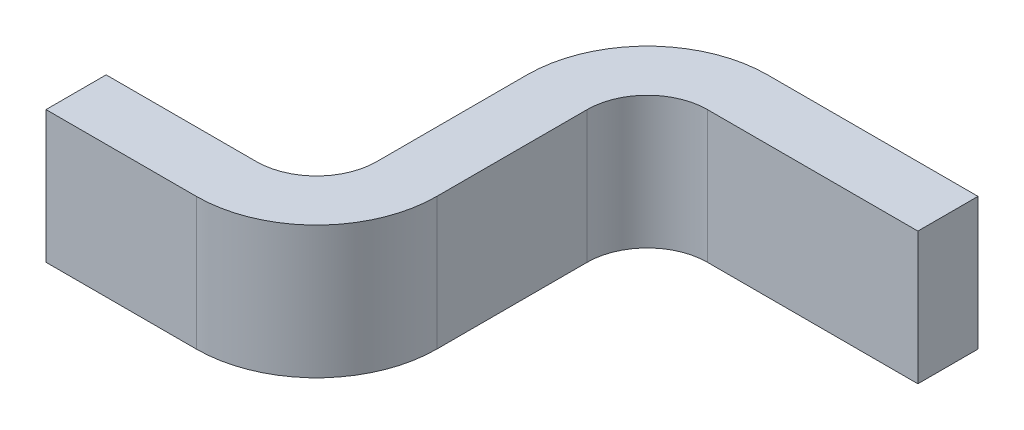
ISO-10303-21;
HEADER;
FILE_DESCRIPTION(('STEP AP214'),'2;1');
FILE_NAME('part.step','',(''),(''),'','','');
FILE_SCHEMA(('AUTOMOTIVE_DESIGN { 1 0 10303 214 1 1 1 1 }'));
ENDSEC;
DATA;
#1=APPLICATION_CONTEXT('core data for automotive mechanical design processes');
#2=APPLICATION_PROTOCOL_DEFINITION('international standard','automotive_design',2000,#1);
#3=PRODUCT_CONTEXT('',#1,'mechanical');
#4=PRODUCT('Part','Part','',(#3));
#5=PRODUCT_RELATED_PRODUCT_CATEGORY('part','',(#4));
#6=PRODUCT_DEFINITION_FORMATION('','',#4);
#7=PRODUCT_DEFINITION_CONTEXT('part definition',#1,'design');
#8=PRODUCT_DEFINITION('design','',#6,#7);
#9=PRODUCT_DEFINITION_SHAPE('','',#8);
#10=(LENGTH_UNIT() NAMED_UNIT(*) SI_UNIT(.MILLI.,.METRE.));
#11=(NAMED_UNIT(*) PLANE_ANGLE_UNIT() SI_UNIT($,.RADIAN.));
#12=(NAMED_UNIT(*) SI_UNIT($,.STERADIAN.) SOLID_ANGLE_UNIT());
#13=UNCERTAINTY_MEASURE_WITH_UNIT(LENGTH_MEASURE(1.E-05),#10,'distance_accuracy_value','');
#14=(GEOMETRIC_REPRESENTATION_CONTEXT(3) GLOBAL_UNCERTAINTY_ASSIGNED_CONTEXT((#13)) GLOBAL_UNIT_ASSIGNED_CONTEXT((#10,
#11,#12)) REPRESENTATION_CONTEXT('',''));
#15=CARTESIAN_POINT('',(0.,0.,0.));
#16=DIRECTION('',(0.,0.,1.));
#17=DIRECTION('',(1.,0.,0.));
#18=AXIS2_PLACEMENT_3D('',#15,#16,#17);
#19=CARTESIAN_POINT('',(0.,0.11,0.65));
#20=DIRECTION('',(0.,0.,-1.));
#21=DIRECTION('',(-1.,0.,0.));
#22=AXIS2_PLACEMENT_3D('',#19,#20,#21);
#23=PLANE('',#22);
#24=DIRECTION('',(1.,0.,0.));
#25=VECTOR('',#24,1.);
#26=CARTESIAN_POINT('',(0.,0.11,0.65));
#27=LINE('',#26,#25);
#28=CARTESIAN_POINT('',(0.25,0.11,0.65));
#29=VERTEX_POINT('',#28);
#30=CARTESIAN_POINT('',(0.,0.11,0.65));
#31=VERTEX_POINT('',#30);
#32=EDGE_CURVE('E104',#29,#31,#27,.F.);
#33=ORIENTED_EDGE('',*,*,#32,.T.);
#34=DIRECTION('',(0.,1.,0.));
#35=VECTOR('',#34,1.);
#36=CARTESIAN_POINT('',(0.,-0.11,0.65));
#37=LINE('',#36,#35);
#38=CARTESIAN_POINT('',(0.,-0.11,0.65));
#39=VERTEX_POINT('',#38);
#40=EDGE_CURVE('E113',#39,#31,#37,.T.);
#41=ORIENTED_EDGE('',*,*,#40,.F.);
#42=DIRECTION('',(1.,0.,0.));
#43=VECTOR('',#42,1.);
#44=CARTESIAN_POINT('',(0.,-0.11,0.65));
#45=LINE('',#44,#43);
#46=CARTESIAN_POINT('',(0.25,-0.11,0.65));
#47=VERTEX_POINT('',#46);
#48=EDGE_CURVE('E118',#39,#47,#45,.T.);
#49=ORIENTED_EDGE('',*,*,#48,.T.);
#50=DIRECTION('',(0.,1.,0.));
#51=VECTOR('',#50,1.);
#52=CARTESIAN_POINT('',(0.25,0.11,0.65));
#53=LINE('',#52,#51);
#54=EDGE_CURVE('E116',#29,#47,#53,.F.);
#55=ORIENTED_EDGE('',*,*,#54,.F.);
#56=EDGE_LOOP('',(#33,#41,#49,#55));
#57=FACE_BOUND('',#56,.T.);
#58=ADVANCED_FACE('F17',(#57),#23,.F.);
#59=CARTESIAN_POINT('',(0.,-0.11,0.55));
#60=DIRECTION('',(-1.,0.,0.));
#61=DIRECTION('',(0.,0.,1.));
#62=AXIS2_PLACEMENT_3D('',#59,#60,#61);
#63=PLANE('',#62);
#64=DIRECTION('',(0.,0.,1.));
#65=VECTOR('',#64,1.);
#66=CARTESIAN_POINT('',(0.,0.11,0.55));
#67=LINE('',#66,#65);
#68=CARTESIAN_POINT('',(0.,0.11,0.55));
#69=VERTEX_POINT('',#68);
#70=EDGE_CURVE('E111',#31,#69,#67,.F.);
#71=ORIENTED_EDGE('',*,*,#70,.T.);
#72=DIRECTION('',(0.,1.,0.));
#73=VECTOR('',#72,1.);
#74=CARTESIAN_POINT('',(0.,-0.11,0.55));
#75=LINE('',#74,#73);
#76=CARTESIAN_POINT('',(0.,-0.11,0.55));
#77=VERTEX_POINT('',#76);
#78=EDGE_CURVE('E127',#69,#77,#75,.F.);
#79=ORIENTED_EDGE('',*,*,#78,.T.);
#80=DIRECTION('',(0.,0.,1.));
#81=VECTOR('',#80,1.);
#82=CARTESIAN_POINT('',(0.,-0.11,0.65));
#83=LINE('',#82,#81);
#84=EDGE_CURVE('E140',#77,#39,#83,.T.);
#85=ORIENTED_EDGE('',*,*,#84,.T.);
#86=ORIENTED_EDGE('',*,*,#40,.T.);
#87=EDGE_LOOP('',(#71,#79,#85,#86));
#88=FACE_BOUND('',#87,.T.);
#89=ADVANCED_FACE('F277',(#88),#63,.T.);
#90=CARTESIAN_POINT('',(0.25,0.11,0.45));
#91=DIRECTION('',(0.,1.,0.));
#92=DIRECTION('',(0.,0.,1.));
#93=AXIS2_PLACEMENT_3D('',#90,#91,#92);
#94=CYLINDRICAL_SURFACE('',#93,0.2);
#95=CARTESIAN_POINT('',(0.25,0.11,0.45));
#96=DIRECTION('',(0.,1.,0.));
#97=DIRECTION('',(0.,0.,1.));
#98=AXIS2_PLACEMENT_3D('',#95,#96,#97);
#99=CIRCLE('',#98,0.2);
#100=CARTESIAN_POINT('',(0.45,0.11,0.45));
#101=VERTEX_POINT('',#100);
#102=EDGE_CURVE('E20',#29,#101,#99,.T.);
#103=ORIENTED_EDGE('',*,*,#102,.F.);
#104=ORIENTED_EDGE('',*,*,#54,.T.);
#105=CARTESIAN_POINT('',(0.25,-0.11,0.45));
#106=DIRECTION('',(0.,1.,0.));
#107=DIRECTION('',(0.,0.,1.));
#108=AXIS2_PLACEMENT_3D('',#105,#106,#107);
#109=CIRCLE('',#108,0.2);
#110=CARTESIAN_POINT('',(0.45,-0.11,0.45));
#111=VERTEX_POINT('',#110);
#112=EDGE_CURVE('E178',#111,#47,#109,.F.);
#113=ORIENTED_EDGE('',*,*,#112,.F.);
#114=DIRECTION('',(0.,1.,0.));
#115=VECTOR('',#114,1.);
#116=CARTESIAN_POINT('',(0.45,0.11,0.45));
#117=LINE('',#116,#115);
#118=EDGE_CURVE('E124',#111,#101,#117,.T.);
#119=ORIENTED_EDGE('',*,*,#118,.T.);
#120=EDGE_LOOP('',(#103,#104,#113,#119));
#121=FACE_BOUND('',#120,.T.);
#122=ADVANCED_FACE('F123',(#121),#94,.T.);
#123=CARTESIAN_POINT('',(0.,-0.11,0.55));
#124=DIRECTION('',(0.,0.,1.));
#125=DIRECTION('',(1.,0.,0.));
#126=AXIS2_PLACEMENT_3D('',#123,#124,#125);
#127=PLANE('',#126);
#128=DIRECTION('',(1.,0.,0.));
#129=VECTOR('',#128,1.);
#130=CARTESIAN_POINT('',(0.,-0.11,0.55));
#131=LINE('',#130,#129);
#132=CARTESIAN_POINT('',(0.25,-0.11,0.55));
#133=VERTEX_POINT('',#132);
#134=EDGE_CURVE('E131',#77,#133,#131,.T.);
#135=ORIENTED_EDGE('',*,*,#134,.F.);
#136=ORIENTED_EDGE('',*,*,#78,.F.);
#137=DIRECTION('',(1.,0.,0.));
#138=VECTOR('',#137,1.);
#139=CARTESIAN_POINT('',(0.,0.11,0.55));
#140=LINE('',#139,#138);
#141=CARTESIAN_POINT('',(0.25,0.11,0.55));
#142=VERTEX_POINT('',#141);
#143=EDGE_CURVE('E126',#142,#69,#140,.F.);
#144=ORIENTED_EDGE('',*,*,#143,.F.);
#145=DIRECTION('',(0.,1.,0.));
#146=VECTOR('',#145,1.);
#147=CARTESIAN_POINT('',(0.25,-0.11,0.55));
#148=LINE('',#147,#146);
#149=EDGE_CURVE('E175',#142,#133,#148,.F.);
#150=ORIENTED_EDGE('',*,*,#149,.T.);
#151=EDGE_LOOP('',(#135,#136,#144,#150));
#152=FACE_BOUND('',#151,.T.);
#153=ADVANCED_FACE('F271',(#152),#127,.F.);
#154=CARTESIAN_POINT('',(0.45,0.11,0.45));
#155=DIRECTION('',(-1.,0.,0.));
#156=DIRECTION('',(0.,0.,1.));
#157=AXIS2_PLACEMENT_3D('',#154,#155,#156);
#158=PLANE('',#157);
#159=DIRECTION('',(0.,0.,-1.));
#160=VECTOR('',#159,1.);
#161=CARTESIAN_POINT('',(0.45,0.11,0.45));
#162=LINE('',#161,#160);
#163=CARTESIAN_POINT('',(0.45,0.11,0.2));
#164=VERTEX_POINT('',#163);
#165=EDGE_CURVE('E177',#164,#101,#162,.F.);
#166=ORIENTED_EDGE('',*,*,#165,.T.);
#167=ORIENTED_EDGE('',*,*,#118,.F.);
#168=DIRECTION('',(0.,0.,1.));
#169=VECTOR('',#168,1.);
#170=CARTESIAN_POINT('',(0.45,-0.11,0.45));
#171=LINE('',#170,#169);
#172=CARTESIAN_POINT('',(0.45,-0.11,0.2));
#173=VERTEX_POINT('',#172);
#174=EDGE_CURVE('E174',#111,#173,#171,.F.);
#175=ORIENTED_EDGE('',*,*,#174,.T.);
#176=DIRECTION('',(0.,-1.,0.));
#177=VECTOR('',#176,1.);
#178=CARTESIAN_POINT('',(0.45,0.11,0.2));
#179=LINE('',#178,#177);
#180=EDGE_CURVE('E171',#173,#164,#179,.F.);
#181=ORIENTED_EDGE('',*,*,#180,.T.);
#182=EDGE_LOOP('',(#166,#167,#175,#181));
#183=FACE_BOUND('',#182,.T.);
#184=ADVANCED_FACE('F267',(#183),#158,.F.);
#185=CARTESIAN_POINT('',(0.25,-0.11,0.45));
#186=DIRECTION('',(0.,1.,0.));
#187=DIRECTION('',(0.,0.,1.));
#188=AXIS2_PLACEMENT_3D('',#185,#186,#187);
#189=CYLINDRICAL_SURFACE('',#188,0.1);
#190=CARTESIAN_POINT('',(0.25,-0.11,0.45));
#191=DIRECTION('',(0.,1.,0.));
#192=DIRECTION('',(0.,0.,1.));
#193=AXIS2_PLACEMENT_3D('',#190,#191,#192);
#194=CIRCLE('',#193,0.1);
#195=CARTESIAN_POINT('',(0.35,-0.11,0.45));
#196=VERTEX_POINT('',#195);
#197=EDGE_CURVE('E172',#133,#196,#194,.T.);
#198=ORIENTED_EDGE('',*,*,#197,.F.);
#199=ORIENTED_EDGE('',*,*,#149,.F.);
#200=CARTESIAN_POINT('',(0.25,0.11,0.45));
#201=DIRECTION('',(0.,1.,0.));
#202=DIRECTION('',(0.,0.,1.));
#203=AXIS2_PLACEMENT_3D('',#200,#201,#202);
#204=CIRCLE('',#203,0.1);
#205=CARTESIAN_POINT('',(0.35,0.11,0.45));
#206=VERTEX_POINT('',#205);
#207=EDGE_CURVE('E176',#206,#142,#204,.F.);
#208=ORIENTED_EDGE('',*,*,#207,.F.);
#209=DIRECTION('',(0.,1.,0.));
#210=VECTOR('',#209,1.);
#211=CARTESIAN_POINT('',(0.35,-0.11,0.45));
#212=LINE('',#211,#210);
#213=EDGE_CURVE('E188',#206,#196,#212,.F.);
#214=ORIENTED_EDGE('',*,*,#213,.T.);
#215=EDGE_LOOP('',(#198,#199,#208,#214));
#216=FACE_BOUND('',#215,.T.);
#217=ADVANCED_FACE('F263',(#216),#189,.F.);
#218=CARTESIAN_POINT('',(0.55,0.11,0.2));
#219=DIRECTION('',(0.,-1.,0.));
#220=DIRECTION('',(0.,0.,-1.));
#221=AXIS2_PLACEMENT_3D('',#218,#219,#220);
#222=CYLINDRICAL_SURFACE('',#221,0.1);
#223=CARTESIAN_POINT('',(0.55,0.11,0.2));
#224=DIRECTION('',(0.,-1.,0.));
#225=DIRECTION('',(0.,0.,-1.));
#226=AXIS2_PLACEMENT_3D('',#223,#224,#225);
#227=CIRCLE('',#226,0.1);
#228=CARTESIAN_POINT('',(0.55,0.11,0.1));
#229=VERTEX_POINT('',#228);
#230=EDGE_CURVE('E168',#164,#229,#227,.T.);
#231=ORIENTED_EDGE('',*,*,#230,.F.);
#232=ORIENTED_EDGE('',*,*,#180,.F.);
#233=CARTESIAN_POINT('',(0.55,-0.11,0.2));
#234=DIRECTION('',(0.,-1.,0.));
#235=DIRECTION('',(0.,0.,-1.));
#236=AXIS2_PLACEMENT_3D('',#233,#234,#235);
#237=CIRCLE('',#236,0.1);
#238=CARTESIAN_POINT('',(0.55,-0.11,0.1));
#239=VERTEX_POINT('',#238);
#240=EDGE_CURVE('E163',#239,#173,#237,.F.);
#241=ORIENTED_EDGE('',*,*,#240,.F.);
#242=DIRECTION('',(0.,1.,0.));
#243=VECTOR('',#242,1.);
#244=CARTESIAN_POINT('',(0.55,0.11,0.1));
#245=LINE('',#244,#243);
#246=EDGE_CURVE('E166',#239,#229,#245,.T.);
#247=ORIENTED_EDGE('',*,*,#246,.T.);
#248=EDGE_LOOP('',(#231,#232,#241,#247));
#249=FACE_BOUND('',#248,.T.);
#250=ADVANCED_FACE('F259',(#249),#222,.F.);
#251=CARTESIAN_POINT('',(0.35,-0.11,0.45));
#252=DIRECTION('',(1.,0.,0.));
#253=DIRECTION('',(0.,0.,-1.));
#254=AXIS2_PLACEMENT_3D('',#251,#252,#253);
#255=PLANE('',#254);
#256=DIRECTION('',(0.,0.,-1.));
#257=VECTOR('',#256,1.);
#258=CARTESIAN_POINT('',(0.35,-0.11,0.45));
#259=LINE('',#258,#257);
#260=CARTESIAN_POINT('',(0.35,-0.11,0.2));
#261=VERTEX_POINT('',#260);
#262=EDGE_CURVE('E167',#196,#261,#259,.T.);
#263=ORIENTED_EDGE('',*,*,#262,.F.);
#264=ORIENTED_EDGE('',*,*,#213,.F.);
#265=DIRECTION('',(0.,0.,-1.));
#266=VECTOR('',#265,1.);
#267=CARTESIAN_POINT('',(0.35,0.11,0.45));
#268=LINE('',#267,#266);
#269=CARTESIAN_POINT('',(0.35,0.11,0.2));
#270=VERTEX_POINT('',#269);
#271=EDGE_CURVE('E170',#270,#206,#268,.F.);
#272=ORIENTED_EDGE('',*,*,#271,.F.);
#273=DIRECTION('',(0.,-1.,0.));
#274=VECTOR('',#273,1.);
#275=CARTESIAN_POINT('',(0.35,-0.11,0.2));
#276=LINE('',#275,#274);
#277=EDGE_CURVE('E159',#261,#270,#276,.F.);
#278=ORIENTED_EDGE('',*,*,#277,.F.);
#279=EDGE_LOOP('',(#263,#264,#272,#278));
#280=FACE_BOUND('',#279,.T.);
#281=ADVANCED_FACE('F255',(#280),#255,.F.);
#282=CARTESIAN_POINT('',(0.55,0.11,0.1));
#283=DIRECTION('',(0.,0.,-1.));
#284=DIRECTION('',(-1.,0.,0.));
#285=AXIS2_PLACEMENT_3D('',#282,#283,#284);
#286=PLANE('',#285);
#287=DIRECTION('',(1.,0.,0.));
#288=VECTOR('',#287,1.);
#289=CARTESIAN_POINT('',(0.55,0.11,0.1));
#290=LINE('',#289,#288);
#291=CARTESIAN_POINT('',(0.9,0.11,0.1));
#292=VERTEX_POINT('',#291);
#293=EDGE_CURVE('E162',#292,#229,#290,.F.);
#294=ORIENTED_EDGE('',*,*,#293,.T.);
#295=ORIENTED_EDGE('',*,*,#246,.F.);
#296=DIRECTION('',(1.,0.,0.));
#297=VECTOR('',#296,1.);
#298=CARTESIAN_POINT('',(0.55,-0.11,0.1));
#299=LINE('',#298,#297);
#300=CARTESIAN_POINT('',(0.9,-0.11,0.1));
#301=VERTEX_POINT('',#300);
#302=EDGE_CURVE('E216',#239,#301,#299,.T.);
#303=ORIENTED_EDGE('',*,*,#302,.T.);
#304=DIRECTION('',(0.,1.,0.));
#305=VECTOR('',#304,1.);
#306=CARTESIAN_POINT('',(0.9,-0.11,0.1));
#307=LINE('',#306,#305);
#308=EDGE_CURVE('E197',#301,#292,#307,.T.);
#309=ORIENTED_EDGE('',*,*,#308,.T.);
#310=EDGE_LOOP('',(#294,#295,#303,#309));
#311=FACE_BOUND('',#310,.T.);
#312=ADVANCED_FACE('F252',(#311),#286,.F.);
#313=CARTESIAN_POINT('',(0.55,0.11,0.));
#314=DIRECTION('',(0.,-1.,0.));
#315=DIRECTION('',(0.,0.,-1.));
#316=AXIS2_PLACEMENT_3D('',#313,#314,#315);
#317=PLANE('',#316);
#318=DIRECTION('',(1.,0.,0.));
#319=VECTOR('',#318,1.);
#320=CARTESIAN_POINT('',(0.55,0.11,0.));
#321=LINE('',#320,#319);
#322=CARTESIAN_POINT('',(0.9,0.11,0.));
#323=VERTEX_POINT('',#322);
#324=CARTESIAN_POINT('',(0.55,0.11,0.));
#325=VERTEX_POINT('',#324);
#326=EDGE_CURVE('E205',#323,#325,#321,.F.);
#327=ORIENTED_EDGE('',*,*,#326,.T.);
#328=CARTESIAN_POINT('',(0.55,0.11,0.2));
#329=DIRECTION('',(0.,-1.,0.));
#330=DIRECTION('',(0.,0.,-1.));
#331=AXIS2_PLACEMENT_3D('',#328,#329,#330);
#332=CIRCLE('',#331,0.2);
#333=EDGE_CURVE('E160',#270,#325,#332,.T.);
#334=ORIENTED_EDGE('',*,*,#333,.F.);
#335=ORIENTED_EDGE('',*,*,#271,.T.);
#336=ORIENTED_EDGE('',*,*,#207,.T.);
#337=ORIENTED_EDGE('',*,*,#143,.T.);
#338=ORIENTED_EDGE('',*,*,#70,.F.);
#339=ORIENTED_EDGE('',*,*,#32,.F.);
#340=ORIENTED_EDGE('',*,*,#102,.T.);
#341=ORIENTED_EDGE('',*,*,#165,.F.);
#342=ORIENTED_EDGE('',*,*,#230,.T.);
#343=ORIENTED_EDGE('',*,*,#293,.F.);
#344=DIRECTION('',(0.,0.,1.));
#345=VECTOR('',#344,1.);
#346=CARTESIAN_POINT('',(0.9,0.11,0.));
#347=LINE('',#346,#345);
#348=EDGE_CURVE('E200',#292,#323,#347,.F.);
#349=ORIENTED_EDGE('',*,*,#348,.T.);
#350=EDGE_LOOP('',(#327,#334,#335,#336,#337,#338,#339,#340,#341,#342,#343,#349));
#351=FACE_BOUND('',#350,.T.);
#352=ADVANCED_FACE('F107',(#351),#317,.F.);
#353=CARTESIAN_POINT('',(0.55,-0.11,0.2));
#354=DIRECTION('',(0.,-1.,0.));
#355=DIRECTION('',(0.,0.,-1.));
#356=AXIS2_PLACEMENT_3D('',#353,#354,#355);
#357=CYLINDRICAL_SURFACE('',#356,0.2);
#358=CARTESIAN_POINT('',(0.55,-0.11,0.2));
#359=DIRECTION('',(0.,-1.,0.));
#360=DIRECTION('',(0.,0.,-1.));
#361=AXIS2_PLACEMENT_3D('',#358,#359,#360);
#362=CIRCLE('',#361,0.2);
#363=CARTESIAN_POINT('',(0.55,-0.11,0.));
#364=VERTEX_POINT('',#363);
#365=EDGE_CURVE('E157',#364,#261,#362,.F.);
#366=ORIENTED_EDGE('',*,*,#365,.T.);
#367=ORIENTED_EDGE('',*,*,#277,.T.);
#368=ORIENTED_EDGE('',*,*,#333,.T.);
#369=DIRECTION('',(0.,1.,0.));
#370=VECTOR('',#369,1.);
#371=CARTESIAN_POINT('',(0.55,-0.11,0.));
#372=LINE('',#371,#370);
#373=EDGE_CURVE('E211',#325,#364,#372,.F.);
#374=ORIENTED_EDGE('',*,*,#373,.T.);
#375=EDGE_LOOP('',(#366,#367,#368,#374));
#376=FACE_BOUND('',#375,.T.);
#377=ADVANCED_FACE('F233',(#376),#357,.T.);
#378=CARTESIAN_POINT('',(0.55,-0.11,0.1));
#379=DIRECTION('',(0.,1.,0.));
#380=DIRECTION('',(0.,0.,1.));
#381=AXIS2_PLACEMENT_3D('',#378,#379,#380);
#382=PLANE('',#381);
#383=ORIENTED_EDGE('',*,*,#302,.F.);
#384=ORIENTED_EDGE('',*,*,#240,.T.);
#385=ORIENTED_EDGE('',*,*,#174,.F.);
#386=ORIENTED_EDGE('',*,*,#112,.T.);
#387=ORIENTED_EDGE('',*,*,#48,.F.);
#388=ORIENTED_EDGE('',*,*,#84,.F.);
#389=ORIENTED_EDGE('',*,*,#134,.T.);
#390=ORIENTED_EDGE('',*,*,#197,.T.);
#391=ORIENTED_EDGE('',*,*,#262,.T.);
#392=ORIENTED_EDGE('',*,*,#365,.F.);
#393=DIRECTION('',(1.,0.,0.));
#394=VECTOR('',#393,1.);
#395=CARTESIAN_POINT('',(0.55,-0.11,0.));
#396=LINE('',#395,#394);
#397=CARTESIAN_POINT('',(0.9,-0.11,0.));
#398=VERTEX_POINT('',#397);
#399=EDGE_CURVE('E26',#364,#398,#396,.T.);
#400=ORIENTED_EDGE('',*,*,#399,.T.);
#401=DIRECTION('',(0.,0.,1.));
#402=VECTOR('',#401,1.);
#403=CARTESIAN_POINT('',(0.9,-0.11,0.));
#404=LINE('',#403,#402);
#405=EDGE_CURVE('E34',#398,#301,#404,.T.);
#406=ORIENTED_EDGE('',*,*,#405,.T.);
#407=EDGE_LOOP('',(#383,#384,#385,#386,#387,#388,#389,#390,#391,#392,#400,#406));
#408=FACE_BOUND('',#407,.T.);
#409=ADVANCED_FACE('F227',(#408),#382,.F.);
#410=CARTESIAN_POINT('',(0.9,-0.11,0.));
#411=DIRECTION('',(-1.,0.,0.));
#412=DIRECTION('',(0.,0.,1.));
#413=AXIS2_PLACEMENT_3D('',#410,#411,#412);
#414=PLANE('',#413);
#415=ORIENTED_EDGE('',*,*,#348,.F.);
#416=ORIENTED_EDGE('',*,*,#308,.F.);
#417=ORIENTED_EDGE('',*,*,#405,.F.);
#418=DIRECTION('',(0.,1.,0.));
#419=VECTOR('',#418,1.);
#420=CARTESIAN_POINT('',(0.9,-0.11,0.));
#421=LINE('',#420,#419);
#422=EDGE_CURVE('E11',#398,#323,#421,.T.);
#423=ORIENTED_EDGE('',*,*,#422,.T.);
#424=EDGE_LOOP('',(#415,#416,#417,#423));
#425=FACE_BOUND('',#424,.T.);
#426=ADVANCED_FACE('F237',(#425),#414,.F.);
#427=CARTESIAN_POINT('',(0.55,-0.11,0.));
#428=DIRECTION('',(0.,0.,1.));
#429=DIRECTION('',(1.,0.,0.));
#430=AXIS2_PLACEMENT_3D('',#427,#428,#429);
#431=PLANE('',#430);
#432=ORIENTED_EDGE('',*,*,#399,.F.);
#433=ORIENTED_EDGE('',*,*,#373,.F.);
#434=ORIENTED_EDGE('',*,*,#326,.F.);
#435=ORIENTED_EDGE('',*,*,#422,.F.);
#436=EDGE_LOOP('',(#432,#433,#434,#435));
#437=FACE_BOUND('',#436,.T.);
#438=ADVANCED_FACE('F231',(#437),#431,.F.);
#439=CLOSED_SHELL('',(#58,#89,#122,#153,#184,#217,#250,#281,#312,#352,#377,#409,#426,#438));
#440=MANIFOLD_SOLID_BREP('B1',#439);
#441=ADVANCED_BREP_SHAPE_REPRESENTATION('',(#18,#440),#14);
#442=SHAPE_DEFINITION_REPRESENTATION(#9,#441);
ENDSEC;
END-ISO-10303-21;
